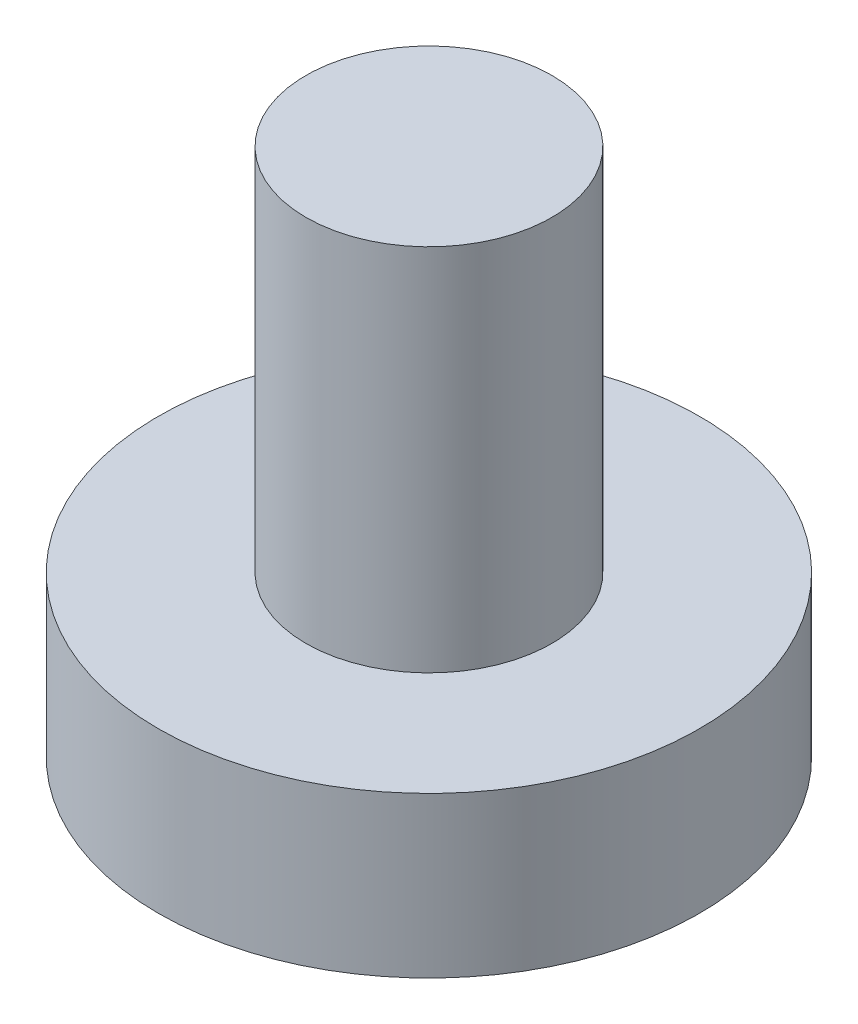
ISO-10303-21;
HEADER;
FILE_DESCRIPTION(('STEP AP214'),'2;1');
FILE_NAME('part.step','',(''),(''),'','','');
FILE_SCHEMA(('AUTOMOTIVE_DESIGN { 1 0 10303 214 1 1 1 1 }'));
ENDSEC;
DATA;
#1=APPLICATION_CONTEXT('core data for automotive mechanical design processes');
#2=APPLICATION_PROTOCOL_DEFINITION('international standard','automotive_design',2000,#1);
#3=PRODUCT_CONTEXT('',#1,'mechanical');
#4=PRODUCT('Part','Part','',(#3));
#5=PRODUCT_RELATED_PRODUCT_CATEGORY('part','',(#4));
#6=PRODUCT_DEFINITION_FORMATION('','',#4);
#7=PRODUCT_DEFINITION_CONTEXT('part definition',#1,'design');
#8=PRODUCT_DEFINITION('design','',#6,#7);
#9=PRODUCT_DEFINITION_SHAPE('','',#8);
#10=(LENGTH_UNIT() NAMED_UNIT(*) SI_UNIT(.MILLI.,.METRE.));
#11=(NAMED_UNIT(*) PLANE_ANGLE_UNIT() SI_UNIT($,.RADIAN.));
#12=(NAMED_UNIT(*) SI_UNIT($,.STERADIAN.) SOLID_ANGLE_UNIT());
#13=UNCERTAINTY_MEASURE_WITH_UNIT(LENGTH_MEASURE(1.E-05),#10,'distance_accuracy_value','');
#14=(GEOMETRIC_REPRESENTATION_CONTEXT(3) GLOBAL_UNCERTAINTY_ASSIGNED_CONTEXT((#13)) GLOBAL_UNIT_ASSIGNED_CONTEXT((#10,
#11,#12)) REPRESENTATION_CONTEXT('',''));
#15=CARTESIAN_POINT('',(0.,0.,0.));
#16=DIRECTION('',(0.,0.,1.));
#17=DIRECTION('',(1.,0.,0.));
#18=AXIS2_PLACEMENT_3D('',#15,#16,#17);
#19=CARTESIAN_POINT('',(0.,0.,0.));
#20=DIRECTION('',(0.,1.,0.));
#21=DIRECTION('',(0.,0.,1.));
#22=AXIS2_PLACEMENT_3D('',#19,#20,#21);
#23=PLANE('',#22);
#24=CARTESIAN_POINT('',(0.,0.,0.));
#25=DIRECTION('',(0.,1.,0.));
#26=DIRECTION('',(0.,0.,1.));
#27=AXIS2_PLACEMENT_3D('',#24,#25,#26);
#28=CIRCLE('',#27,2.2);
#29=CARTESIAN_POINT('',(0.,0.,2.2));
#30=VERTEX_POINT('',#29);
#31=EDGE_CURVE('E95',#30,#30,#28,.T.);
#32=ORIENTED_EDGE('',*,*,#31,.F.);
#33=EDGE_LOOP('',(#32));
#34=FACE_BOUND('',#33,.T.);
#35=DIRECTION('',(1.,0.,0.));
#36=VECTOR('',#35,1.);
#37=CARTESIAN_POINT('',(0.,0.,1.));
#38=LINE('',#37,#36);
#39=CARTESIAN_POINT('',(-0.577350269189625,0.,1.));
#40=VERTEX_POINT('',#39);
#41=CARTESIAN_POINT('',(0.577350269189626,0.,1.));
#42=VERTEX_POINT('',#41);
#43=EDGE_CURVE('E108',#40,#42,#38,.T.);
#44=ORIENTED_EDGE('',*,*,#43,.T.);
#45=DIRECTION('',(0.5,0.,-0.866025403784439));
#46=VECTOR('',#45,1.);
#47=CARTESIAN_POINT('',(0.866025403784439,0.,0.5));
#48=LINE('',#47,#46);
#49=CARTESIAN_POINT('',(1.15470053837925,0.,0.));
#50=VERTEX_POINT('',#49);
#51=EDGE_CURVE('E179',#42,#50,#48,.T.);
#52=ORIENTED_EDGE('',*,*,#51,.T.);
#53=DIRECTION('',(-0.5,0.,-0.866025403784438));
#54=VECTOR('',#53,1.);
#55=CARTESIAN_POINT('',(0.866025403784439,0.,-0.500000000000001));
#56=LINE('',#55,#54);
#57=CARTESIAN_POINT('',(0.577350269189626,0.,-1.));
#58=VERTEX_POINT('',#57);
#59=EDGE_CURVE('E183',#50,#58,#56,.T.);
#60=ORIENTED_EDGE('',*,*,#59,.T.);
#61=DIRECTION('',(-1.,0.,0.));
#62=VECTOR('',#61,1.);
#63=CARTESIAN_POINT('',(0.,0.,-1.));
#64=LINE('',#63,#62);
#65=CARTESIAN_POINT('',(-0.577350269189626,0.,-1.));
#66=VERTEX_POINT('',#65);
#67=EDGE_CURVE('E186',#58,#66,#64,.T.);
#68=ORIENTED_EDGE('',*,*,#67,.T.);
#69=DIRECTION('',(-0.5,0.,0.866025403784439));
#70=VECTOR('',#69,1.);
#71=CARTESIAN_POINT('',(-0.866025403784439,0.,-0.5));
#72=LINE('',#71,#70);
#73=CARTESIAN_POINT('',(-1.15470053837925,0.,0.));
#74=VERTEX_POINT('',#73);
#75=EDGE_CURVE('E169',#66,#74,#72,.T.);
#76=ORIENTED_EDGE('',*,*,#75,.T.);
#77=DIRECTION('',(0.5,0.,0.866025403784439));
#78=VECTOR('',#77,1.);
#79=CARTESIAN_POINT('',(-0.866025403784438,0.,0.5));
#80=LINE('',#79,#78);
#81=EDGE_CURVE('E189',#74,#40,#80,.T.);
#82=ORIENTED_EDGE('',*,*,#81,.T.);
#83=EDGE_LOOP('',(#44,#52,#60,#68,#76,#82));
#84=FACE_BOUND('',#83,.T.);
#85=ADVANCED_FACE('F91',(#34,#84),#23,.F.);
#86=CARTESIAN_POINT('',(0.,1.3,0.));
#87=DIRECTION('',(0.,-1.,0.));
#88=DIRECTION('',(0.,0.,-1.));
#89=AXIS2_PLACEMENT_3D('',#86,#87,#88);
#90=CYLINDRICAL_SURFACE('',#89,2.2);
#91=CARTESIAN_POINT('',(0.,1.3,0.));
#92=DIRECTION('',(0.,1.,0.));
#93=DIRECTION('',(0.,0.,1.));
#94=AXIS2_PLACEMENT_3D('',#91,#92,#93);
#95=CIRCLE('',#94,2.2);
#96=CARTESIAN_POINT('',(0.,1.3,2.2));
#97=VERTEX_POINT('',#96);
#98=EDGE_CURVE('E100',#97,#97,#95,.T.);
#99=ORIENTED_EDGE('',*,*,#98,.F.);
#100=EDGE_LOOP('',(#99));
#101=FACE_BOUND('',#100,.T.);
#102=ORIENTED_EDGE('',*,*,#31,.T.);
#103=EDGE_LOOP('',(#102));
#104=FACE_BOUND('',#103,.T.);
#105=ADVANCED_FACE('F93',(#101,#104),#90,.T.);
#106=CARTESIAN_POINT('',(0.,1.3,0.));
#107=DIRECTION('',(0.,1.,0.));
#108=DIRECTION('',(0.,0.,1.));
#109=AXIS2_PLACEMENT_3D('',#106,#107,#108);
#110=PLANE('',#109);
#111=CARTESIAN_POINT('',(0.,1.3,0.));
#112=DIRECTION('',(0.,1.,0.));
#113=DIRECTION('',(0.,0.,1.));
#114=AXIS2_PLACEMENT_3D('',#111,#112,#113);
#115=CIRCLE('',#114,1.);
#116=CARTESIAN_POINT('',(0.,1.3,1.));
#117=VERTEX_POINT('',#116);
#118=EDGE_CURVE('E12',#117,#117,#115,.T.);
#119=ORIENTED_EDGE('',*,*,#118,.F.);
#120=EDGE_LOOP('',(#119));
#121=FACE_BOUND('',#120,.T.);
#122=ORIENTED_EDGE('',*,*,#98,.T.);
#123=EDGE_LOOP('',(#122));
#124=FACE_BOUND('',#123,.T.);
#125=ADVANCED_FACE('F208',(#121,#124),#110,.T.);
#126=CARTESIAN_POINT('',(0.,0.6,1.));
#127=DIRECTION('',(0.,0.,-1.));
#128=DIRECTION('',(-1.,0.,0.));
#129=AXIS2_PLACEMENT_3D('',#126,#127,#128);
#130=PLANE('',#129);
#131=ORIENTED_EDGE('',*,*,#43,.F.);
#132=DIRECTION('',(0.,-1.,0.));
#133=VECTOR('',#132,1.);
#134=CARTESIAN_POINT('',(-0.577350269189625,0.6,1.));
#135=LINE('',#134,#133);
#136=CARTESIAN_POINT('',(-0.577350269189625,0.6,1.));
#137=VERTEX_POINT('',#136);
#138=EDGE_CURVE('E174',#137,#40,#135,.T.);
#139=ORIENTED_EDGE('',*,*,#138,.F.);
#140=DIRECTION('',(1.,0.,0.));
#141=VECTOR('',#140,1.);
#142=CARTESIAN_POINT('',(0.,0.6,1.));
#143=LINE('',#142,#141);
#144=CARTESIAN_POINT('',(0.577350269189626,0.6,1.));
#145=VERTEX_POINT('',#144);
#146=EDGE_CURVE('E192',#137,#145,#143,.T.);
#147=ORIENTED_EDGE('',*,*,#146,.T.);
#148=DIRECTION('',(0.,-1.,0.));
#149=VECTOR('',#148,1.);
#150=CARTESIAN_POINT('',(0.577350269189626,0.6,1.));
#151=LINE('',#150,#149);
#152=EDGE_CURVE('E198',#145,#42,#151,.T.);
#153=ORIENTED_EDGE('',*,*,#152,.T.);
#154=EDGE_LOOP('',(#131,#139,#147,#153));
#155=FACE_BOUND('',#154,.T.);
#156=ADVANCED_FACE('F210',(#155),#130,.T.);
#157=CARTESIAN_POINT('',(0.866025403784439,0.6,0.5));
#158=DIRECTION('',(-0.866025403784439,0.,-0.5));
#159=DIRECTION('',(-0.5,0.,0.866025403784439));
#160=AXIS2_PLACEMENT_3D('',#157,#158,#159);
#161=PLANE('',#160);
#162=ORIENTED_EDGE('',*,*,#51,.F.);
#163=ORIENTED_EDGE('',*,*,#152,.F.);
#164=DIRECTION('',(0.5,0.,-0.866025403784439));
#165=VECTOR('',#164,1.);
#166=CARTESIAN_POINT('',(0.866025403784439,0.6,0.5));
#167=LINE('',#166,#165);
#168=CARTESIAN_POINT('',(1.15470053837925,0.6,0.));
#169=VERTEX_POINT('',#168);
#170=EDGE_CURVE('E147',#145,#169,#167,.T.);
#171=ORIENTED_EDGE('',*,*,#170,.T.);
#172=DIRECTION('',(0.,-1.,0.));
#173=VECTOR('',#172,1.);
#174=CARTESIAN_POINT('',(1.15470053837925,0.6,0.));
#175=LINE('',#174,#173);
#176=EDGE_CURVE('E196',#169,#50,#175,.T.);
#177=ORIENTED_EDGE('',*,*,#176,.T.);
#178=EDGE_LOOP('',(#162,#163,#171,#177));
#179=FACE_BOUND('',#178,.T.);
#180=ADVANCED_FACE('F220',(#179),#161,.T.);
#181=CARTESIAN_POINT('',(0.866025403784439,0.6,-0.500000000000001));
#182=DIRECTION('',(-0.866025403784438,0.,0.5));
#183=DIRECTION('',(0.5,0.,0.866025403784438));
#184=AXIS2_PLACEMENT_3D('',#181,#182,#183);
#185=PLANE('',#184);
#186=ORIENTED_EDGE('',*,*,#59,.F.);
#187=ORIENTED_EDGE('',*,*,#176,.F.);
#188=DIRECTION('',(-0.5,0.,-0.866025403784438));
#189=VECTOR('',#188,1.);
#190=CARTESIAN_POINT('',(0.866025403784439,0.6,-0.500000000000001));
#191=LINE('',#190,#189);
#192=CARTESIAN_POINT('',(0.577350269189626,0.6,-1.));
#193=VERTEX_POINT('',#192);
#194=EDGE_CURVE('E165',#169,#193,#191,.T.);
#195=ORIENTED_EDGE('',*,*,#194,.T.);
#196=DIRECTION('',(0.,-1.,0.));
#197=VECTOR('',#196,1.);
#198=CARTESIAN_POINT('',(0.577350269189626,0.6,-1.));
#199=LINE('',#198,#197);
#200=EDGE_CURVE('E162',#193,#58,#199,.T.);
#201=ORIENTED_EDGE('',*,*,#200,.T.);
#202=EDGE_LOOP('',(#186,#187,#195,#201));
#203=FACE_BOUND('',#202,.T.);
#204=ADVANCED_FACE('F218',(#203),#185,.T.);
#205=CARTESIAN_POINT('',(0.,0.6,-1.));
#206=DIRECTION('',(0.,0.,1.));
#207=DIRECTION('',(1.,0.,0.));
#208=AXIS2_PLACEMENT_3D('',#205,#206,#207);
#209=PLANE('',#208);
#210=ORIENTED_EDGE('',*,*,#67,.F.);
#211=ORIENTED_EDGE('',*,*,#200,.F.);
#212=DIRECTION('',(-1.,0.,0.));
#213=VECTOR('',#212,1.);
#214=CARTESIAN_POINT('',(0.,0.6,-1.));
#215=LINE('',#214,#213);
#216=CARTESIAN_POINT('',(-0.577350269189626,0.6,-1.));
#217=VERTEX_POINT('',#216);
#218=EDGE_CURVE('E157',#193,#217,#215,.T.);
#219=ORIENTED_EDGE('',*,*,#218,.T.);
#220=DIRECTION('',(0.,-1.,0.));
#221=VECTOR('',#220,1.);
#222=CARTESIAN_POINT('',(-0.577350269189626,0.6,-1.));
#223=LINE('',#222,#221);
#224=EDGE_CURVE('E161',#217,#66,#223,.T.);
#225=ORIENTED_EDGE('',*,*,#224,.T.);
#226=EDGE_LOOP('',(#210,#211,#219,#225));
#227=FACE_BOUND('',#226,.T.);
#228=ADVANCED_FACE('F160',(#227),#209,.T.);
#229=CARTESIAN_POINT('',(-0.866025403784439,0.6,-0.5));
#230=DIRECTION('',(0.866025403784439,0.,0.5));
#231=DIRECTION('',(0.5,0.,-0.866025403784439));
#232=AXIS2_PLACEMENT_3D('',#229,#230,#231);
#233=PLANE('',#232);
#234=ORIENTED_EDGE('',*,*,#75,.F.);
#235=ORIENTED_EDGE('',*,*,#224,.F.);
#236=DIRECTION('',(-0.5,0.,0.866025403784439));
#237=VECTOR('',#236,1.);
#238=CARTESIAN_POINT('',(-0.866025403784439,0.6,-0.5));
#239=LINE('',#238,#237);
#240=CARTESIAN_POINT('',(-1.15470053837925,0.6,0.));
#241=VERTEX_POINT('',#240);
#242=EDGE_CURVE('E164',#217,#241,#239,.T.);
#243=ORIENTED_EDGE('',*,*,#242,.T.);
#244=DIRECTION('',(0.,-1.,0.));
#245=VECTOR('',#244,1.);
#246=CARTESIAN_POINT('',(-1.15470053837925,0.6,0.));
#247=LINE('',#246,#245);
#248=EDGE_CURVE('E138',#241,#74,#247,.T.);
#249=ORIENTED_EDGE('',*,*,#248,.T.);
#250=EDGE_LOOP('',(#234,#235,#243,#249));
#251=FACE_BOUND('',#250,.T.);
#252=ADVANCED_FACE('F167',(#251),#233,.T.);
#253=CARTESIAN_POINT('',(-0.866025403784438,0.6,0.5));
#254=DIRECTION('',(0.866025403784438,0.,-0.5));
#255=DIRECTION('',(-0.5,0.,-0.866025403784439));
#256=AXIS2_PLACEMENT_3D('',#253,#254,#255);
#257=PLANE('',#256);
#258=ORIENTED_EDGE('',*,*,#81,.F.);
#259=ORIENTED_EDGE('',*,*,#248,.F.);
#260=DIRECTION('',(0.5,0.,0.866025403784439));
#261=VECTOR('',#260,1.);
#262=CARTESIAN_POINT('',(-0.866025403784438,0.6,0.5));
#263=LINE('',#262,#261);
#264=EDGE_CURVE('E116',#241,#137,#263,.T.);
#265=ORIENTED_EDGE('',*,*,#264,.T.);
#266=ORIENTED_EDGE('',*,*,#138,.T.);
#267=EDGE_LOOP('',(#258,#259,#265,#266));
#268=FACE_BOUND('',#267,.T.);
#269=ADVANCED_FACE('F209',(#268),#257,.T.);
#270=CARTESIAN_POINT('',(0.,0.6,0.));
#271=DIRECTION('',(0.,1.,0.));
#272=DIRECTION('',(0.,0.,1.));
#273=AXIS2_PLACEMENT_3D('',#270,#271,#272);
#274=PLANE('',#273);
#275=ORIENTED_EDGE('',*,*,#146,.F.);
#276=ORIENTED_EDGE('',*,*,#264,.F.);
#277=ORIENTED_EDGE('',*,*,#242,.F.);
#278=ORIENTED_EDGE('',*,*,#218,.F.);
#279=ORIENTED_EDGE('',*,*,#194,.F.);
#280=ORIENTED_EDGE('',*,*,#170,.F.);
#281=EDGE_LOOP('',(#275,#276,#277,#278,#279,#280));
#282=FACE_BOUND('',#281,.T.);
#283=ADVANCED_FACE('F172',(#282),#274,.F.);
#284=CARTESIAN_POINT('',(0.,4.3,0.));
#285=DIRECTION('',(0.,-1.,0.));
#286=DIRECTION('',(0.,0.,-1.));
#287=AXIS2_PLACEMENT_3D('',#284,#285,#286);
#288=CYLINDRICAL_SURFACE('',#287,1.);
#289=CARTESIAN_POINT('',(0.,4.3,0.));
#290=DIRECTION('',(0.,1.,0.));
#291=DIRECTION('',(0.,0.,1.));
#292=AXIS2_PLACEMENT_3D('',#289,#290,#291);
#293=CIRCLE('',#292,1.);
#294=CARTESIAN_POINT('',(0.,4.3,1.));
#295=VERTEX_POINT('',#294);
#296=EDGE_CURVE('E180',#295,#295,#293,.T.);
#297=ORIENTED_EDGE('',*,*,#296,.F.);
#298=EDGE_LOOP('',(#297));
#299=FACE_BOUND('',#298,.T.);
#300=ORIENTED_EDGE('',*,*,#118,.T.);
#301=EDGE_LOOP('',(#300));
#302=FACE_BOUND('',#301,.T.);
#303=ADVANCED_FACE('F241',(#299,#302),#288,.T.);
#304=CARTESIAN_POINT('',(0.,4.3,0.));
#305=DIRECTION('',(0.,1.,0.));
#306=DIRECTION('',(0.,0.,1.));
#307=AXIS2_PLACEMENT_3D('',#304,#305,#306);
#308=PLANE('',#307);
#309=ORIENTED_EDGE('',*,*,#296,.T.);
#310=EDGE_LOOP('',(#309));
#311=FACE_BOUND('',#310,.T.);
#312=ADVANCED_FACE('F242',(#311),#308,.T.);
#313=CLOSED_SHELL('',(#85,#105,#125,#156,#180,#204,#228,#252,#269,#283,#303,#312));
#314=MANIFOLD_SOLID_BREP('B2',#313);
#315=ADVANCED_BREP_SHAPE_REPRESENTATION('',(#18,#314),#14);
#316=SHAPE_DEFINITION_REPRESENTATION(#9,#315);
ENDSEC;
END-ISO-10303-21;
